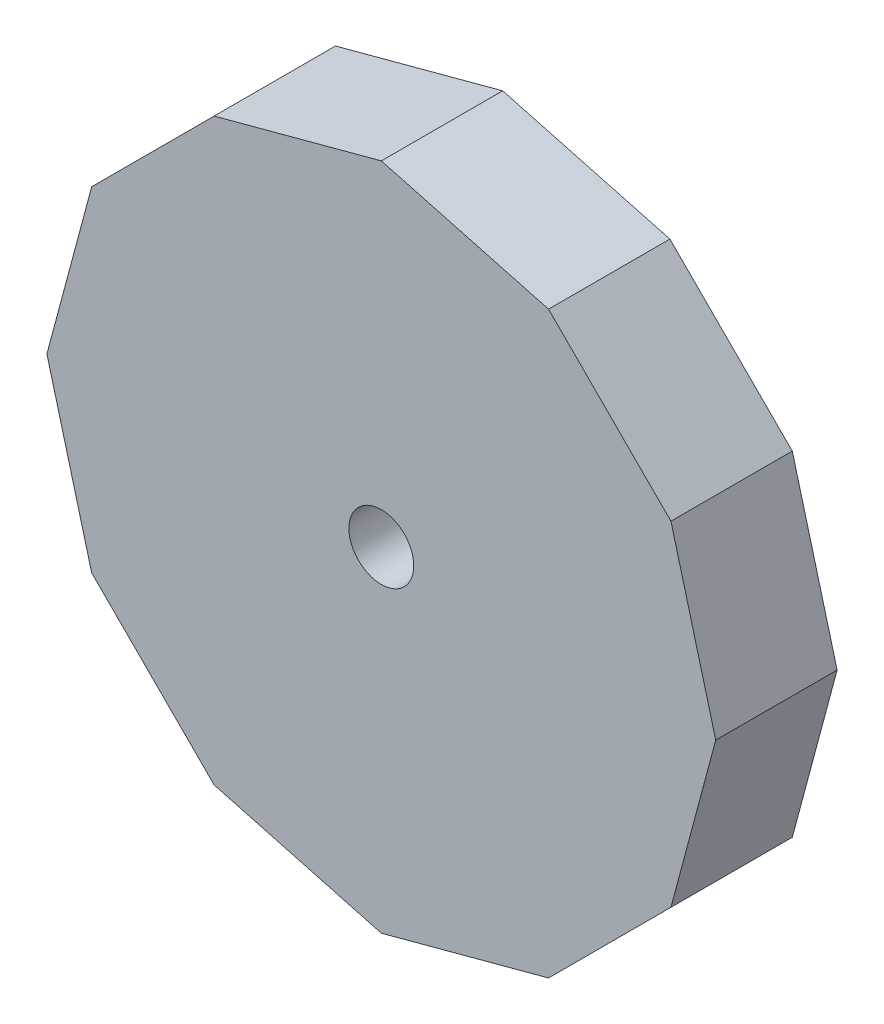
ISO-10303-21;
HEADER;
FILE_DESCRIPTION(('STEP AP214'),'2;1');
FILE_NAME('part.step','',(''),(''),'','','');
FILE_SCHEMA(('AUTOMOTIVE_DESIGN { 1 0 10303 214 1 1 1 1 }'));
ENDSEC;
DATA;
#1=APPLICATION_CONTEXT('core data for automotive mechanical design processes');
#2=APPLICATION_PROTOCOL_DEFINITION('international standard','automotive_design',2000,#1);
#3=PRODUCT_CONTEXT('',#1,'mechanical');
#4=PRODUCT('Part','Part','',(#3));
#5=PRODUCT_RELATED_PRODUCT_CATEGORY('part','',(#4));
#6=PRODUCT_DEFINITION_FORMATION('','',#4);
#7=PRODUCT_DEFINITION_CONTEXT('part definition',#1,'design');
#8=PRODUCT_DEFINITION('design','',#6,#7);
#9=PRODUCT_DEFINITION_SHAPE('','',#8);
#10=(LENGTH_UNIT() NAMED_UNIT(*) SI_UNIT(.MILLI.,.METRE.));
#11=(NAMED_UNIT(*) PLANE_ANGLE_UNIT() SI_UNIT($,.RADIAN.));
#12=(NAMED_UNIT(*) SI_UNIT($,.STERADIAN.) SOLID_ANGLE_UNIT());
#13=UNCERTAINTY_MEASURE_WITH_UNIT(LENGTH_MEASURE(1.E-05),#10,'distance_accuracy_value','');
#14=(GEOMETRIC_REPRESENTATION_CONTEXT(3) GLOBAL_UNCERTAINTY_ASSIGNED_CONTEXT((#13)) GLOBAL_UNIT_ASSIGNED_CONTEXT((#10,
#11,#12)) REPRESENTATION_CONTEXT('',''));
#15=CARTESIAN_POINT('',(0.,0.,0.));
#16=DIRECTION('',(0.,0.,1.));
#17=DIRECTION('',(1.,0.,0.));
#18=AXIS2_PLACEMENT_3D('',#15,#16,#17);
#19=CARTESIAN_POINT('',(-2750.81999999993,-4764.56000287049,1188.22000008192));
#20=DIRECTION('',(0.707106781186534,0.707106781186561,0.));
#21=DIRECTION('',(-0.707106781186561,0.707106781186534,0.));
#22=AXIS2_PLACEMENT_3D('',#19,#20,#21);
#23=PLANE('',#22);
#24=DIRECTION('',(0.,0.,-1.));
#25=VECTOR('',#24,1.);
#26=CARTESIAN_POINT('',(-4764.56000247659,-2750.8200003939,1188.22000008191));
#27=LINE('',#26,#25);
#28=CARTESIAN_POINT('',(-4764.56000247659,-2750.8200003939,1188.22000008191));
#29=VERTEX_POINT('',#28);
#30=CARTESIAN_POINT('',(-4764.56000247659,-2750.82000039391,-808.219999918092));
#31=VERTEX_POINT('',#30);
#32=EDGE_CURVE('E327',#29,#31,#27,.T.);
#33=ORIENTED_EDGE('',*,*,#32,.T.);
#34=DIRECTION('',(-0.707106781186561,0.707106781186534,0.));
#35=VECTOR('',#34,1.);
#36=CARTESIAN_POINT('',(-2750.81999999993,-4764.56000287049,-808.219999918085));
#37=LINE('',#36,#35);
#38=CARTESIAN_POINT('',(-2750.81999999993,-4764.56000287049,-808.219999918085));
#39=VERTEX_POINT('',#38);
#40=EDGE_CURVE('E63',#39,#31,#37,.T.);
#41=ORIENTED_EDGE('',*,*,#40,.F.);
#42=DIRECTION('',(0.,0.,-1.));
#43=VECTOR('',#42,1.);
#44=CARTESIAN_POINT('',(-2750.81999999999,-4764.56000287045,1188.22000008192));
#45=LINE('',#44,#43);
#46=CARTESIAN_POINT('',(-2750.81999999993,-4764.56000287049,1188.22000008192));
#47=VERTEX_POINT('',#46);
#48=EDGE_CURVE('E187',#47,#39,#45,.T.);
#49=ORIENTED_EDGE('',*,*,#48,.F.);
#50=DIRECTION('',(0.707106781186561,-0.707106781186534,0.));
#51=VECTOR('',#50,1.);
#52=CARTESIAN_POINT('',(-2750.81999999993,-4764.56000287049,1188.22000008192));
#53=LINE('',#52,#51);
#54=EDGE_CURVE('E336',#29,#47,#53,.T.);
#55=ORIENTED_EDGE('',*,*,#54,.F.);
#56=EDGE_LOOP('',(#33,#41,#49,#55));
#57=FACE_BOUND('',#56,.T.);
#58=ADVANCED_FACE('F46',(#57),#23,.F.);
#59=CARTESIAN_POINT('',(-2.06853544642894E-11,-3.93812871202215E-07,1188.2200000819));
#60=DIRECTION('',(0.,0.,-1.));
#61=DIRECTION('',(-0.499999999999983,-0.866025403784448,0.));
#62=AXIS2_PLACEMENT_3D('',#59,#60,#61);
#63=CYLINDRICAL_SURFACE('',#62,533.4);
#64=CARTESIAN_POINT('',(-2.06853544642893E-11,-3.93822974231739E-07,-1714.9999999181));
#65=DIRECTION('',(0.,0.,1.));
#66=DIRECTION('',(1.,0.,0.));
#67=AXIS2_PLACEMENT_3D('',#64,#65,#66);
#68=CIRCLE('',#67,533.4);
#69=CARTESIAN_POINT('',(533.399999999979,-3.93819249519447E-07,-1714.9999999181));
#70=VERTEX_POINT('',#69);
#71=EDGE_CURVE('E332',#70,#70,#68,.F.);
#72=ORIENTED_EDGE('',*,*,#71,.T.);
#73=EDGE_LOOP('',(#72));
#74=FACE_BOUND('',#73,.T.);
#75=CARTESIAN_POINT('',(-2.06853544642894E-11,-3.93812871202215E-07,1188.2200000819));
#76=DIRECTION('',(0.,0.,-1.));
#77=DIRECTION('',(0.499999999999983,0.866025403784448,0.));
#78=AXIS2_PLACEMENT_3D('',#75,#76,#77);
#79=CIRCLE('',#78,533.4);
#80=CARTESIAN_POINT('',(266.69999999997,461.937949984812,1188.2200000819));
#81=VERTEX_POINT('',#80);
#82=EDGE_CURVE('E53',#81,#81,#79,.T.);
#83=ORIENTED_EDGE('',*,*,#82,.F.);
#84=EDGE_LOOP('',(#83));
#85=FACE_BOUND('',#84,.T.);
#86=ADVANCED_FACE('F343',(#74,#85),#63,.F.);
#87=CARTESIAN_POINT('',(-2.06853544642894E-11,-3.93812871202215E-07,1188.2200000819));
#88=DIRECTION('',(0.,0.,1.));
#89=DIRECTION('',(0.499999999999983,0.866025403784448,0.));
#90=AXIS2_PLACEMENT_3D('',#87,#88,#89);
#91=PLANE('',#90);
#92=ORIENTED_EDGE('',*,*,#82,.T.);
#93=EDGE_LOOP('',(#92));
#94=FACE_BOUND('',#93,.T.);
#95=ORIENTED_EDGE('',*,*,#54,.T.);
#96=DIRECTION('',(0.96592582628907,-0.258819045102514,0.));
#97=VECTOR('',#96,1.);
#98=CARTESIAN_POINT('',(1.77323923217765E-11,-5501.64000039381,1188.22000008192));
#99=LINE('',#98,#97);
#100=CARTESIAN_POINT('',(1.99528383710268E-11,-5501.64000039381,1188.22000008192));
#101=VERTEX_POINT('',#100);
#102=EDGE_CURVE('E731',#47,#101,#99,.T.);
#103=ORIENTED_EDGE('',*,*,#102,.T.);
#104=DIRECTION('',(0.965925826289066,0.258819045102528,0.));
#105=VECTOR('',#104,1.);
#106=CARTESIAN_POINT('',(2750.82000000002,-4764.56000287041,1188.22000008192));
#107=LINE('',#106,#105);
#108=CARTESIAN_POINT('',(2750.82000000002,-4764.56000287041,1188.22000008192));
#109=VERTEX_POINT('',#108);
#110=EDGE_CURVE('E177',#101,#109,#107,.T.);
#111=ORIENTED_EDGE('',*,*,#110,.T.);
#112=DIRECTION('',(0.707106781186541,0.707106781186554,0.));
#113=VECTOR('',#112,1.);
#114=CARTESIAN_POINT('',(4764.56000247663,-2750.82000039377,1188.22000008191));
#115=LINE('',#114,#113);
#116=CARTESIAN_POINT('',(4764.56000247663,-2750.82000039377,1188.22000008191));
#117=VERTEX_POINT('',#116);
#118=EDGE_CURVE('E208',#109,#117,#115,.T.);
#119=ORIENTED_EDGE('',*,*,#118,.T.);
#120=DIRECTION('',(0.258819045102511,0.965925826289071,0.));
#121=VECTOR('',#120,1.);
#122=CARTESIAN_POINT('',(5501.63999999998,-3.93755139604934E-07,1188.2200000819));
#123=LINE('',#122,#121);
#124=CARTESIAN_POINT('',(5501.63999999998,-3.93753030181188E-07,1188.2200000819));
#125=VERTEX_POINT('',#124);
#126=EDGE_CURVE('E221',#117,#125,#123,.T.);
#127=ORIENTED_EDGE('',*,*,#126,.T.);
#128=DIRECTION('',(-0.258819045102532,0.965925826289066,0.));
#129=VECTOR('',#128,1.);
#130=CARTESIAN_POINT('',(4764.56000247657,2750.81999960624,1188.22000008189));
#131=LINE('',#130,#129);
#132=CARTESIAN_POINT('',(4764.56000247657,2750.81999960625,1188.22000008189));
#133=VERTEX_POINT('',#132);
#134=EDGE_CURVE('E235',#125,#133,#131,.T.);
#135=ORIENTED_EDGE('',*,*,#134,.T.);
#136=DIRECTION('',(-0.707106781186556,0.707106781186539,0.));
#137=VECTOR('',#136,1.);
#138=CARTESIAN_POINT('',(2750.81999999992,4764.56000208284,1188.22000008188));
#139=LINE('',#138,#137);
#140=CARTESIAN_POINT('',(2750.81999999992,4764.56000208284,1188.22000008188));
#141=VERTEX_POINT('',#140);
#142=EDGE_CURVE('E249',#133,#141,#139,.T.);
#143=ORIENTED_EDGE('',*,*,#142,.T.);
#144=DIRECTION('',(-0.965925826289072,0.258819045102508,0.));
#145=VECTOR('',#144,1.);
#146=CARTESIAN_POINT('',(-9.75208480364212E-11,5501.63999960619,1188.22000008188));
#147=LINE('',#146,#145);
#148=CARTESIAN_POINT('',(-9.9515219346711E-11,5501.63999960619,1188.22000008188));
#149=VERTEX_POINT('',#148);
#150=EDGE_CURVE('E263',#141,#149,#147,.T.);
#151=ORIENTED_EDGE('',*,*,#150,.T.);
#152=DIRECTION('',(-0.965925826289065,-0.258819045102535,0.));
#153=VECTOR('',#152,1.);
#154=CARTESIAN_POINT('',(-2750.82000000009,4764.56000208277,1188.22000008188));
#155=LINE('',#154,#153);
#156=CARTESIAN_POINT('',(-2750.8200000001,4764.56000208276,1188.22000008188));
#157=VERTEX_POINT('',#156);
#158=EDGE_CURVE('E277',#149,#157,#155,.T.);
#159=ORIENTED_EDGE('',*,*,#158,.T.);
#160=DIRECTION('',(-0.707106781186536,-0.707106781186559,0.));
#161=VECTOR('',#160,1.);
#162=CARTESIAN_POINT('',(-4764.56000247669,2750.81999960611,1188.22000008189));
#163=LINE('',#162,#161);
#164=CARTESIAN_POINT('',(-4764.56000247669,2750.81999960611,1188.22000008189));
#165=VERTEX_POINT('',#164);
#166=EDGE_CURVE('E291',#157,#165,#163,.T.);
#167=ORIENTED_EDGE('',*,*,#166,.T.);
#168=DIRECTION('',(-0.258819045102504,-0.965925826289073,0.));
#169=VECTOR('',#168,1.);
#170=CARTESIAN_POINT('',(-5501.64000000002,-3.93908905493845E-07,1188.2200000819));
#171=LINE('',#170,#169);
#172=CARTESIAN_POINT('',(-5501.64000000002,-3.93910792872987E-07,1188.2200000819));
#173=VERTEX_POINT('',#172);
#174=EDGE_CURVE('E305',#165,#173,#171,.T.);
#175=ORIENTED_EDGE('',*,*,#174,.T.);
#176=DIRECTION('',(0.258819045102538,-0.965925826289064,0.));
#177=VECTOR('',#176,1.);
#178=CARTESIAN_POINT('',(-4764.56000247659,-2750.8200003939,1188.22000008191));
#179=LINE('',#178,#177);
#180=EDGE_CURVE('E321',#173,#29,#179,.T.);
#181=ORIENTED_EDGE('',*,*,#180,.T.);
#182=EDGE_LOOP('',(#95,#103,#111,#119,#127,#135,#143,#151,#159,#167,#175,#181));
#183=FACE_BOUND('',#182,.T.);
#184=ADVANCED_FACE('F340',(#94,#183),#91,.T.);
#185=CARTESIAN_POINT('',(-2750.81999999993,-4764.56000287049,-808.219999918085));
#186=DIRECTION('',(0.142947377566867,0.142947377566876,0.979352895790638));
#187=DIRECTION('',(0.490348103876195,0.849307829308669,-0.195537587435302));
#188=AXIS2_PLACEMENT_3D('',#185,#186,#187);
#189=PLANE('',#188);
#190=DIRECTION('',(0.84930782930865,0.490348103876227,-0.195537587435301));
#191=VECTOR('',#190,1.);
#192=CARTESIAN_POINT('',(-958.000474190437,-553.101832051473,-1684.61068054542));
#193=LINE('',#192,#191);
#194=CARTESIAN_POINT('',(-826.00597017154,-476.894769624608,-1714.9999999181));
#195=VERTEX_POINT('',#194);
#196=EDGE_CURVE('E319',#31,#195,#193,.T.);
#197=ORIENTED_EDGE('',*,*,#196,.T.);
#198=DIRECTION('',(0.70710678118656,-0.707106781186535,0.));
#199=VECTOR('',#198,1.);
#200=CARTESIAN_POINT('',(355.419631537177,-1658.32037133328,-1714.99999991809));
#201=LINE('',#200,#199);
#202=CARTESIAN_POINT('',(-476.894769230774,-826.00597056536,-1714.9999999181));
#203=VERTEX_POINT('',#202);
#204=EDGE_CURVE('E12',#195,#203,#201,.T.);
#205=ORIENTED_EDGE('',*,*,#204,.T.);
#206=DIRECTION('',(-0.490348103876206,-0.849307829308662,0.195537587435302));
#207=VECTOR('',#206,1.);
#208=CARTESIAN_POINT('',(-553.101831657647,-958.000474584253,-1684.61068054542));
#209=LINE('',#208,#207);
#210=EDGE_CURVE('E188',#203,#39,#209,.T.);
#211=ORIENTED_EDGE('',*,*,#210,.T.);
#212=ORIENTED_EDGE('',*,*,#40,.T.);
#213=EDGE_LOOP('',(#197,#205,#211,#212));
#214=FACE_BOUND('',#213,.T.);
#215=ADVANCED_FACE('F350',(#214),#189,.F.);
#216=CARTESIAN_POINT('',(-2.06886671161642E-11,-3.93822974231739E-07,-1714.9999999181));
#217=DIRECTION('',(0.,0.,1.));
#218=DIRECTION('',(1.,0.,0.));
#219=AXIS2_PLACEMENT_3D('',#216,#217,#218);
#220=PLANE('',#219);
#221=ORIENTED_EDGE('',*,*,#71,.F.);
#222=EDGE_LOOP('',(#221));
#223=FACE_BOUND('',#222,.T.);
#224=ORIENTED_EDGE('',*,*,#204,.F.);
#225=DIRECTION('',(0.258819045102537,-0.965925826289064,0.));
#226=VECTOR('',#225,1.);
#227=CARTESIAN_POINT('',(-521.357755554834,-1613.85738500923,-1714.99999991809));
#228=LINE('',#227,#226);
#229=CARTESIAN_POINT('',(-953.78953846156,-3.93839738599411E-07,-1714.9999999181));
#230=VERTEX_POINT('',#229);
#231=EDGE_CURVE('E329',#230,#195,#228,.T.);
#232=ORIENTED_EDGE('',*,*,#231,.F.);
#233=DIRECTION('',(-0.258819045102505,-0.965925826289072,0.));
#234=VECTOR('',#233,1.);
#235=CARTESIAN_POINT('',(-1258.43775307823,-1136.96261577847,-1714.9999999181));
#236=LINE('',#235,#234);
#237=CARTESIAN_POINT('',(-826.005970171557,476.894768836933,-1714.9999999181));
#238=VERTEX_POINT('',#237);
#239=EDGE_CURVE('E311',#238,#230,#236,.T.);
#240=ORIENTED_EDGE('',*,*,#239,.F.);
#241=DIRECTION('',(-0.707106781186537,-0.707106781186558,0.));
#242=VECTOR('',#241,1.);
#243=CARTESIAN_POINT('',(-1658.32037093948,-355.419631931014,-1714.9999999181));
#244=LINE('',#243,#242);
#245=CARTESIAN_POINT('',(-476.894769230803,826.005969777698,-1714.9999999181));
#246=VERTEX_POINT('',#245);
#247=EDGE_CURVE('E297',#246,#238,#244,.T.);
#248=ORIENTED_EDGE('',*,*,#247,.F.);
#249=DIRECTION('',(-0.965925826289065,-0.258819045102534,0.));
#250=VECTOR('',#249,1.);
#251=CARTESIAN_POINT('',(-1613.85738461542,521.357755160996,-1714.9999999181));
#252=LINE('',#251,#250);
#253=CARTESIAN_POINT('',(-3.39960303214757E-11,953.789538067717,-1714.9999999181));
#254=VERTEX_POINT('',#253);
#255=EDGE_CURVE('E283',#254,#246,#252,.T.);
#256=ORIENTED_EDGE('',*,*,#255,.F.);
#257=DIRECTION('',(-0.965925826289072,0.258819045102508,0.));
#258=VECTOR('',#257,1.);
#259=CARTESIAN_POINT('',(-1136.96261538466,1258.43775268439,-1714.9999999181));
#260=LINE('',#259,#258);
#261=CARTESIAN_POINT('',(476.894769230738,826.005969777712,-1714.9999999181));
#262=VERTEX_POINT('',#261);
#263=EDGE_CURVE('E269',#262,#254,#260,.T.);
#264=ORIENTED_EDGE('',*,*,#263,.F.);
#265=DIRECTION('',(-0.707106781186556,0.707106781186539,0.));
#266=VECTOR('',#265,1.);
#267=CARTESIAN_POINT('',(-355.419631537206,1658.32037054564,-1714.9999999181));
#268=LINE('',#267,#266);
#269=CARTESIAN_POINT('',(826.005970171503,476.894768836957,-1714.9999999181));
#270=VERTEX_POINT('',#269);
#271=EDGE_CURVE('E255',#270,#262,#268,.T.);
#272=ORIENTED_EDGE('',*,*,#271,.F.);
#273=DIRECTION('',(-0.258819045102531,0.965925826289066,0.));
#274=VECTOR('',#273,1.);
#275=CARTESIAN_POINT('',(521.357755554805,1613.85738422157,-1714.9999999181));
#276=LINE('',#275,#274);
#277=CARTESIAN_POINT('',(953.789538461519,-3.93812760179912E-07,-1714.9999999181));
#278=VERTEX_POINT('',#277);
#279=EDGE_CURVE('E241',#278,#270,#276,.T.);
#280=ORIENTED_EDGE('',*,*,#279,.F.);
#281=DIRECTION('',(0.258819045102512,0.965925826289071,0.));
#282=VECTOR('',#281,1.);
#283=CARTESIAN_POINT('',(1258.4377530782,1136.96261499081,-1714.9999999181));
#284=LINE('',#283,#282);
#285=CARTESIAN_POINT('',(826.005970171512,-476.894769624585,-1714.9999999181));
#286=VERTEX_POINT('',#285);
#287=EDGE_CURVE('E227',#286,#278,#284,.T.);
#288=ORIENTED_EDGE('',*,*,#287,.F.);
#289=DIRECTION('',(0.707106781186542,0.707106781186553,0.));
#290=VECTOR('',#289,1.);
#291=CARTESIAN_POINT('',(1658.32037093944,355.419631143356,-1714.9999999181));
#292=LINE('',#291,#290);
#293=CARTESIAN_POINT('',(476.894769230756,-826.005970565348,-1714.9999999181));
#294=VERTEX_POINT('',#293);
#295=EDGE_CURVE('E214',#294,#286,#292,.T.);
#296=ORIENTED_EDGE('',*,*,#295,.F.);
#297=DIRECTION('',(0.965925826289067,0.258819045102527,0.));
#298=VECTOR('',#297,1.);
#299=CARTESIAN_POINT('',(1613.85738461538,-521.357755948654,-1714.9999999181));
#300=LINE('',#299,#298);
#301=CARTESIAN_POINT('',(-1.40250777148448E-11,-953.789538855363,-1714.9999999181));
#302=VERTEX_POINT('',#301);
#303=EDGE_CURVE('E200',#302,#294,#300,.T.);
#304=ORIENTED_EDGE('',*,*,#303,.F.);
#305=DIRECTION('',(0.96592582628907,-0.258819045102516,0.));
#306=VECTOR('',#305,1.);
#307=CARTESIAN_POINT('',(1136.96261538461,-1258.43775347204,-1714.9999999181));
#308=LINE('',#307,#306);
#309=EDGE_CURVE('E173',#203,#302,#308,.T.);
#310=ORIENTED_EDGE('',*,*,#309,.F.);
#311=EDGE_LOOP('',(#224,#232,#240,#248,#256,#264,#272,#280,#288,#296,#304,#310));
#312=FACE_BOUND('',#311,.T.);
#313=ADVANCED_FACE('F356',(#223,#312),#220,.F.);
#314=CARTESIAN_POINT('',(-4764.56000247659,-2750.8200003939,1188.22000008191));
#315=DIRECTION('',(0.965925826289064,0.258819045102538,0.));
#316=DIRECTION('',(-0.258819045102538,0.965925826289064,0.));
#317=AXIS2_PLACEMENT_3D('',#314,#315,#316);
#318=PLANE('',#317);
#319=DIRECTION('',(0.,0.,-1.));
#320=VECTOR('',#319,1.);
#321=CARTESIAN_POINT('',(-5501.64000000002,-3.93910792872987E-07,1188.2200000819));
#322=LINE('',#321,#320);
#323=CARTESIAN_POINT('',(-5501.64000000002,-3.93917676255739E-07,-808.219999918099));
#324=VERTEX_POINT('',#323);
#325=EDGE_CURVE('E324',#173,#324,#322,.T.);
#326=ORIENTED_EDGE('',*,*,#325,.T.);
#327=DIRECTION('',(-0.258819045102538,0.965925826289064,0.));
#328=VECTOR('',#327,1.);
#329=CARTESIAN_POINT('',(-4764.56000247659,-2750.82000039391,-808.219999918092));
#330=LINE('',#329,#328);
#331=EDGE_CURVE('E314',#31,#324,#330,.T.);
#332=ORIENTED_EDGE('',*,*,#331,.F.);
#333=ORIENTED_EDGE('',*,*,#32,.F.);
#334=ORIENTED_EDGE('',*,*,#180,.F.);
#335=EDGE_LOOP('',(#326,#332,#333,#334));
#336=FACE_BOUND('',#335,.T.);
#337=ADVANCED_FACE('F359',(#336),#318,.F.);
#338=CARTESIAN_POINT('',(-4764.56000247659,-2750.82000039391,-808.219999918092));
#339=DIRECTION('',(0.195269749160709,0.052322371593847,0.979352895790638));
#340=DIRECTION('',(0.84930782930865,0.490348103876227,-0.195537587435301));
#341=AXIS2_PLACEMENT_3D('',#338,#339,#340);
#342=PLANE('',#341);
#343=DIRECTION('',(-0.980696207752423,0.,0.195537587435299));
#344=VECTOR('',#343,1.);
#345=CARTESIAN_POINT('',(-1106.20366331528,-3.93842625179275E-07,-1684.61068054542));
#346=LINE('',#345,#344);
#347=EDGE_CURVE('E316',#230,#324,#346,.T.);
#348=ORIENTED_EDGE('',*,*,#347,.F.);
#349=ORIENTED_EDGE('',*,*,#231,.T.);
#350=ORIENTED_EDGE('',*,*,#196,.F.);
#351=ORIENTED_EDGE('',*,*,#331,.T.);
#352=EDGE_LOOP('',(#348,#349,#350,#351));
#353=FACE_BOUND('',#352,.T.);
#354=ADVANCED_FACE('F363',(#353),#342,.F.);
#355=CARTESIAN_POINT('',(-5501.64000000002,-3.93908905493845E-07,1188.2200000819));
#356=DIRECTION('',(0.965925826289073,-0.258819045102504,0.));
#357=DIRECTION('',(0.258819045102504,0.965925826289073,0.));
#358=AXIS2_PLACEMENT_3D('',#355,#356,#357);
#359=PLANE('',#358);
#360=DIRECTION('',(0.,0.,-1.));
#361=VECTOR('',#360,1.);
#362=CARTESIAN_POINT('',(-4764.56000247669,2750.81999960611,1188.22000008189));
#363=LINE('',#362,#361);
#364=CARTESIAN_POINT('',(-4764.56000247669,2750.8199996061,-808.21999991811));
#365=VERTEX_POINT('',#364);
#366=EDGE_CURVE('E308',#165,#365,#363,.T.);
#367=ORIENTED_EDGE('',*,*,#366,.T.);
#368=DIRECTION('',(0.258819045102504,0.965925826289073,0.));
#369=VECTOR('',#368,1.);
#370=CARTESIAN_POINT('',(-5501.64000000002,-3.93916010921203E-07,-808.219999918099));
#371=LINE('',#370,#369);
#372=EDGE_CURVE('E300',#324,#365,#371,.T.);
#373=ORIENTED_EDGE('',*,*,#372,.F.);
#374=ORIENTED_EDGE('',*,*,#325,.F.);
#375=ORIENTED_EDGE('',*,*,#174,.F.);
#376=EDGE_LOOP('',(#367,#373,#374,#375));
#377=FACE_BOUND('',#376,.T.);
#378=ADVANCED_FACE('F367',(#377),#359,.F.);
#379=CARTESIAN_POINT('',(-5501.64000000002,-3.93916010921203E-07,-808.219999918099));
#380=DIRECTION('',(0.195269749160711,-0.0523223715938336,0.979352895790639));
#381=DIRECTION('',(0.980696207752423,0.,-0.195537587435299));
#382=AXIS2_PLACEMENT_3D('',#379,#380,#381);
#383=PLANE('',#382);
#384=DIRECTION('',(-0.849307829308668,0.490348103876198,0.195537587435297));
#385=VECTOR('',#384,1.);
#386=CARTESIAN_POINT('',(-958.000474190457,553.101831263793,-1684.61068054543));
#387=LINE('',#386,#385);
#388=EDGE_CURVE('E302',#238,#365,#387,.T.);
#389=ORIENTED_EDGE('',*,*,#388,.F.);
#390=ORIENTED_EDGE('',*,*,#239,.T.);
#391=ORIENTED_EDGE('',*,*,#347,.T.);
#392=ORIENTED_EDGE('',*,*,#372,.T.);
#393=EDGE_LOOP('',(#389,#390,#391,#392));
#394=FACE_BOUND('',#393,.T.);
#395=ADVANCED_FACE('F371',(#394),#383,.F.);
#396=CARTESIAN_POINT('',(-4764.56000247669,2750.81999960611,1188.22000008189));
#397=DIRECTION('',(0.707106781186559,-0.707106781186536,0.));
#398=DIRECTION('',(0.707106781186537,0.707106781186559,0.));
#399=AXIS2_PLACEMENT_3D('',#396,#397,#398);
#400=PLANE('',#399);
#401=DIRECTION('',(0.,0.,-1.));
#402=VECTOR('',#401,1.);
#403=CARTESIAN_POINT('',(-2750.8200000001,4764.56000208276,1188.22000008188));
#404=LINE('',#403,#402);
#405=CARTESIAN_POINT('',(-2750.8200000001,4764.56000208276,-808.219999918117));
#406=VERTEX_POINT('',#405);
#407=EDGE_CURVE('E294',#157,#406,#404,.T.);
#408=ORIENTED_EDGE('',*,*,#407,.T.);
#409=DIRECTION('',(0.707106781186536,0.707106781186559,0.));
#410=VECTOR('',#409,1.);
#411=CARTESIAN_POINT('',(-4764.56000247669,2750.8199996061,-808.21999991811));
#412=LINE('',#411,#410);
#413=EDGE_CURVE('E286',#365,#406,#412,.T.);
#414=ORIENTED_EDGE('',*,*,#413,.F.);
#415=ORIENTED_EDGE('',*,*,#366,.F.);
#416=ORIENTED_EDGE('',*,*,#166,.F.);
#417=EDGE_LOOP('',(#408,#414,#415,#416));
#418=FACE_BOUND('',#417,.T.);
#419=ADVANCED_FACE('F375',(#418),#400,.F.);
#420=CARTESIAN_POINT('',(-4764.56000247669,2750.8199996061,-808.21999991811));
#421=DIRECTION('',(0.142947377566872,-0.142947377566864,0.979352895790639));
#422=DIRECTION('',(0.849307829308668,-0.490348103876198,-0.195537587435297));
#423=AXIS2_PLACEMENT_3D('',#420,#421,#422);
#424=PLANE('',#423);
#425=DIRECTION('',(-0.490348103876224,0.849307829308653,0.195537587435296));
#426=VECTOR('',#425,1.);
#427=CARTESIAN_POINT('',(-553.101831657668,958.000473796595,-1684.61068054543));
#428=LINE('',#427,#426);
#429=EDGE_CURVE('E288',#246,#406,#428,.T.);
#430=ORIENTED_EDGE('',*,*,#429,.F.);
#431=ORIENTED_EDGE('',*,*,#247,.T.);
#432=ORIENTED_EDGE('',*,*,#388,.T.);
#433=ORIENTED_EDGE('',*,*,#413,.T.);
#434=EDGE_LOOP('',(#430,#431,#432,#433));
#435=FACE_BOUND('',#434,.T.);
#436=ADVANCED_FACE('F379',(#435),#424,.F.);
#437=CARTESIAN_POINT('',(-2750.82000000009,4764.56000208277,1188.22000008188));
#438=DIRECTION('',(0.258819045102535,-0.965925826289065,0.));
#439=DIRECTION('',(0.965925826289065,0.258819045102535,0.));
#440=AXIS2_PLACEMENT_3D('',#437,#438,#439);
#441=PLANE('',#440);
#442=DIRECTION('',(0.,0.,-1.));
#443=VECTOR('',#442,1.);
#444=CARTESIAN_POINT('',(-9.9515219346711E-11,5501.63999960619,1188.22000008188));
#445=LINE('',#444,#443);
#446=CARTESIAN_POINT('',(-9.95152193467109E-11,5501.63999960618,-808.21999991812));
#447=VERTEX_POINT('',#446);
#448=EDGE_CURVE('E280',#149,#447,#445,.T.);
#449=ORIENTED_EDGE('',*,*,#448,.T.);
#450=DIRECTION('',(0.965925826289065,0.258819045102535,0.));
#451=VECTOR('',#450,1.);
#452=CARTESIAN_POINT('',(-2750.82000000009,4764.56000208276,-808.219999918117));
#453=LINE('',#452,#451);
#454=EDGE_CURVE('E272',#406,#447,#453,.T.);
#455=ORIENTED_EDGE('',*,*,#454,.F.);
#456=ORIENTED_EDGE('',*,*,#407,.F.);
#457=ORIENTED_EDGE('',*,*,#158,.F.);
#458=EDGE_LOOP('',(#449,#455,#456,#457));
#459=FACE_BOUND('',#458,.T.);
#460=ADVANCED_FACE('F383',(#459),#441,.F.);
#461=CARTESIAN_POINT('',(-2750.82000000009,4764.56000208276,-808.219999918117));
#462=DIRECTION('',(0.0523223715938429,-0.195269749160706,0.979352895790639));
#463=DIRECTION('',(0.490348103876224,-0.849307829308653,-0.195537587435296));
#464=AXIS2_PLACEMENT_3D('',#461,#462,#463);
#465=PLANE('',#464);
#466=DIRECTION('',(0.,0.980696207752423,0.195537587435296));
#467=VECTOR('',#466,1.);
#468=CARTESIAN_POINT('',(-3.66810948925971E-11,1106.20366292144,-1684.61068054543));
#469=LINE('',#468,#467);
#470=EDGE_CURVE('E274',#254,#447,#469,.T.);
#471=ORIENTED_EDGE('',*,*,#470,.F.);
#472=ORIENTED_EDGE('',*,*,#255,.T.);
#473=ORIENTED_EDGE('',*,*,#429,.T.);
#474=ORIENTED_EDGE('',*,*,#454,.T.);
#475=EDGE_LOOP('',(#471,#472,#473,#474));
#476=FACE_BOUND('',#475,.T.);
#477=ADVANCED_FACE('F387',(#476),#465,.F.);
#478=CARTESIAN_POINT('',(-9.75208480364212E-11,5501.63999960619,1188.22000008188));
#479=DIRECTION('',(-0.258819045102508,-0.965925826289072,0.));
#480=DIRECTION('',(0.965925826289072,-0.258819045102508,0.));
#481=AXIS2_PLACEMENT_3D('',#478,#479,#480);
#482=PLANE('',#481);
#483=DIRECTION('',(0.,0.,-1.));
#484=VECTOR('',#483,1.);
#485=CARTESIAN_POINT('',(2750.81999999992,4764.56000208284,1188.22000008188));
#486=LINE('',#485,#484);
#487=CARTESIAN_POINT('',(2750.81999999992,4764.56000208284,-808.219999918117));
#488=VERTEX_POINT('',#487);
#489=EDGE_CURVE('E266',#141,#488,#486,.T.);
#490=ORIENTED_EDGE('',*,*,#489,.T.);
#491=DIRECTION('',(0.965925826289072,-0.258819045102508,0.));
#492=VECTOR('',#491,1.);
#493=CARTESIAN_POINT('',(-9.77428926413461E-11,5501.63999960618,-808.21999991812));
#494=LINE('',#493,#492);
#495=EDGE_CURVE('E258',#447,#488,#494,.T.);
#496=ORIENTED_EDGE('',*,*,#495,.F.);
#497=ORIENTED_EDGE('',*,*,#448,.F.);
#498=ORIENTED_EDGE('',*,*,#150,.F.);
#499=EDGE_LOOP('',(#490,#496,#497,#498));
#500=FACE_BOUND('',#499,.T.);
#501=ADVANCED_FACE('F391',(#500),#482,.F.);
#502=CARTESIAN_POINT('',(-9.77428926413461E-11,5501.63999960618,-808.21999991812));
#503=DIRECTION('',(-0.0523223715938377,-0.195269749160707,0.979352895790639));
#504=DIRECTION('',(0.,-0.980696207752423,-0.195537587435296));
#505=AXIS2_PLACEMENT_3D('',#502,#503,#504);
#506=PLANE('',#505);
#507=DIRECTION('',(0.4903481038762,0.849307829308667,0.195537587435296));
#508=VECTOR('',#507,1.);
#509=CARTESIAN_POINT('',(553.101831657599,958.000473796612,-1684.61068054543));
#510=LINE('',#509,#508);
#511=EDGE_CURVE('E260',#262,#488,#510,.T.);
#512=ORIENTED_EDGE('',*,*,#511,.F.);
#513=ORIENTED_EDGE('',*,*,#263,.T.);
#514=ORIENTED_EDGE('',*,*,#470,.T.);
#515=ORIENTED_EDGE('',*,*,#495,.T.);
#516=EDGE_LOOP('',(#512,#513,#514,#515));
#517=FACE_BOUND('',#516,.T.);
#518=ADVANCED_FACE('F395',(#517),#506,.F.);
#519=CARTESIAN_POINT('',(2750.81999999992,4764.56000208284,1188.22000008188));
#520=DIRECTION('',(-0.707106781186539,-0.707106781186556,0.));
#521=DIRECTION('',(0.707106781186556,-0.707106781186539,0.));
#522=AXIS2_PLACEMENT_3D('',#519,#520,#521);
#523=PLANE('',#522);
#524=DIRECTION('',(0.,0.,-1.));
#525=VECTOR('',#524,1.);
#526=CARTESIAN_POINT('',(4764.56000247657,2750.81999960625,1188.22000008189));
#527=LINE('',#526,#525);
#528=CARTESIAN_POINT('',(4764.56000247657,2750.81999960624,-808.21999991811));
#529=VERTEX_POINT('',#528);
#530=EDGE_CURVE('E252',#133,#529,#527,.T.);
#531=ORIENTED_EDGE('',*,*,#530,.T.);
#532=DIRECTION('',(0.707106781186556,-0.707106781186539,0.));
#533=VECTOR('',#532,1.);
#534=CARTESIAN_POINT('',(2750.81999999992,4764.56000208284,-808.219999918117));
#535=LINE('',#534,#533);
#536=EDGE_CURVE('E244',#488,#529,#535,.T.);
#537=ORIENTED_EDGE('',*,*,#536,.F.);
#538=ORIENTED_EDGE('',*,*,#489,.F.);
#539=ORIENTED_EDGE('',*,*,#142,.F.);
#540=EDGE_LOOP('',(#531,#537,#538,#539));
#541=FACE_BOUND('',#540,.T.);
#542=ADVANCED_FACE('F399',(#541),#523,.F.);
#543=CARTESIAN_POINT('',(2750.81999999992,4764.56000208284,-808.219999918117));
#544=DIRECTION('',(-0.142947377566868,-0.142947377566868,0.979352895790639));
#545=DIRECTION('',(-0.4903481038762,-0.849307829308667,-0.195537587435296));
#546=AXIS2_PLACEMENT_3D('',#543,#544,#545);
#547=PLANE('',#546);
#548=DIRECTION('',(0.849307829308654,0.490348103876222,0.195537587435297));
#549=VECTOR('',#548,1.);
#550=CARTESIAN_POINT('',(958.0004741904,553.101831263821,-1684.61068054543));
#551=LINE('',#550,#549);
#552=EDGE_CURVE('E246',#270,#529,#551,.T.);
#553=ORIENTED_EDGE('',*,*,#552,.F.);
#554=ORIENTED_EDGE('',*,*,#271,.T.);
#555=ORIENTED_EDGE('',*,*,#511,.T.);
#556=ORIENTED_EDGE('',*,*,#536,.T.);
#557=EDGE_LOOP('',(#553,#554,#555,#556));
#558=FACE_BOUND('',#557,.T.);
#559=ADVANCED_FACE('F403',(#558),#547,.F.);
#560=CARTESIAN_POINT('',(4764.56000247657,2750.81999960624,1188.22000008189));
#561=DIRECTION('',(-0.965925826289066,-0.258819045102532,0.));
#562=DIRECTION('',(0.258819045102532,-0.965925826289066,0.));
#563=AXIS2_PLACEMENT_3D('',#560,#561,#562);
#564=PLANE('',#563);
#565=DIRECTION('',(0.,0.,-1.));
#566=VECTOR('',#565,1.);
#567=CARTESIAN_POINT('',(5501.63999999998,-3.93753030181188E-07,1188.2200000819));
#568=LINE('',#567,#566);
#569=CARTESIAN_POINT('',(5501.63999999998,-3.93760024586243E-07,-808.219999918099));
#570=VERTEX_POINT('',#569);
#571=EDGE_CURVE('E238',#125,#570,#568,.T.);
#572=ORIENTED_EDGE('',*,*,#571,.T.);
#573=DIRECTION('',(0.258819045102532,-0.965925826289066,0.));
#574=VECTOR('',#573,1.);
#575=CARTESIAN_POINT('',(4764.56000247657,2750.81999960624,-808.21999991811));
#576=LINE('',#575,#574);
#577=EDGE_CURVE('E230',#529,#570,#576,.T.);
#578=ORIENTED_EDGE('',*,*,#577,.F.);
#579=ORIENTED_EDGE('',*,*,#530,.F.);
#580=ORIENTED_EDGE('',*,*,#134,.F.);
#581=EDGE_LOOP('',(#572,#578,#579,#580));
#582=FACE_BOUND('',#581,.T.);
#583=ADVANCED_FACE('F407',(#582),#564,.F.);
#584=CARTESIAN_POINT('',(4764.56000247657,2750.81999960624,-808.21999991811));
#585=DIRECTION('',(-0.19526974916071,-0.0523223715938388,0.979352895790639));
#586=DIRECTION('',(-0.849307829308654,-0.490348103876222,-0.195537587435297));
#587=AXIS2_PLACEMENT_3D('',#584,#585,#586);
#588=PLANE('',#587);
#589=DIRECTION('',(0.980696207752423,0.,0.195537587435299));
#590=VECTOR('',#589,1.);
#591=CARTESIAN_POINT('',(1106.20366331524,-3.93810761778468E-07,-1684.61068054542));
#592=LINE('',#591,#590);
#593=EDGE_CURVE('E232',#278,#570,#592,.T.);
#594=ORIENTED_EDGE('',*,*,#593,.F.);
#595=ORIENTED_EDGE('',*,*,#279,.T.);
#596=ORIENTED_EDGE('',*,*,#552,.T.);
#597=ORIENTED_EDGE('',*,*,#577,.T.);
#598=EDGE_LOOP('',(#594,#595,#596,#597));
#599=FACE_BOUND('',#598,.T.);
#600=ADVANCED_FACE('F411',(#599),#588,.F.);
#601=CARTESIAN_POINT('',(5501.63999999998,-3.93755139604934E-07,1188.2200000819));
#602=DIRECTION('',(-0.965925826289071,0.258819045102511,0.));
#603=DIRECTION('',(-0.258819045102511,-0.965925826289071,0.));
#604=AXIS2_PLACEMENT_3D('',#601,#602,#603);
#605=PLANE('',#604);
#606=DIRECTION('',(0.,0.,-1.));
#607=VECTOR('',#606,1.);
#608=CARTESIAN_POINT('',(4764.56000247663,-2750.82000039377,1188.22000008191));
#609=LINE('',#608,#607);
#610=CARTESIAN_POINT('',(4764.56000247663,-2750.82000039378,-808.219999918092));
#611=VERTEX_POINT('',#610);
#612=EDGE_CURVE('E224',#117,#611,#609,.T.);
#613=ORIENTED_EDGE('',*,*,#612,.T.);
#614=DIRECTION('',(-0.258819045102511,-0.965925826289071,0.));
#615=VECTOR('',#614,1.);
#616=CARTESIAN_POINT('',(5501.63999999998,-3.93761911965385E-07,-808.219999918099));
#617=LINE('',#616,#615);
#618=EDGE_CURVE('E216',#570,#611,#617,.T.);
#619=ORIENTED_EDGE('',*,*,#618,.F.);
#620=ORIENTED_EDGE('',*,*,#571,.F.);
#621=ORIENTED_EDGE('',*,*,#126,.F.);
#622=EDGE_LOOP('',(#613,#619,#620,#621));
#623=FACE_BOUND('',#622,.T.);
#624=ADVANCED_FACE('F415',(#623),#605,.F.);
#625=CARTESIAN_POINT('',(5501.63999999998,-3.93761911965385E-07,-808.219999918099));
#626=DIRECTION('',(-0.195269749160711,0.0523223715938418,0.979352895790638));
#627=DIRECTION('',(-0.980696207752423,0.,-0.195537587435299));
#628=AXIS2_PLACEMENT_3D('',#625,#626,#627);
#629=PLANE('',#628);
#630=DIRECTION('',(0.849307829308664,-0.490348103876202,0.195537587435301));
#631=VECTOR('',#630,1.);
#632=CARTESIAN_POINT('',(958.000474190412,-553.101832051446,-1684.61068054542));
#633=LINE('',#632,#631);
#634=EDGE_CURVE('E219',#286,#611,#633,.T.);
#635=ORIENTED_EDGE('',*,*,#634,.F.);
#636=ORIENTED_EDGE('',*,*,#287,.T.);
#637=ORIENTED_EDGE('',*,*,#593,.T.);
#638=ORIENTED_EDGE('',*,*,#618,.T.);
#639=EDGE_LOOP('',(#635,#636,#637,#638));
#640=FACE_BOUND('',#639,.T.);
#641=ADVANCED_FACE('F419',(#640),#629,.F.);
#642=CARTESIAN_POINT('',(4764.56000247663,-2750.82000039377,1188.22000008191));
#643=DIRECTION('',(-0.707106781186554,0.707106781186541,0.));
#644=DIRECTION('',(-0.707106781186541,-0.707106781186554,0.));
#645=AXIS2_PLACEMENT_3D('',#642,#643,#644);
#646=PLANE('',#645);
#647=DIRECTION('',(0.,0.,-1.));
#648=VECTOR('',#647,1.);
#649=CARTESIAN_POINT('',(2750.82000000002,-4764.56000287041,1188.22000008192));
#650=LINE('',#649,#648);
#651=CARTESIAN_POINT('',(2750.82000000002,-4764.56000287042,-808.219999918085));
#652=VERTEX_POINT('',#651);
#653=EDGE_CURVE('E211',#109,#652,#650,.T.);
#654=ORIENTED_EDGE('',*,*,#653,.T.);
#655=DIRECTION('',(-0.707106781186541,-0.707106781186554,0.));
#656=VECTOR('',#655,1.);
#657=CARTESIAN_POINT('',(4764.56000247663,-2750.82000039378,-808.219999918092));
#658=LINE('',#657,#656);
#659=EDGE_CURVE('E202',#611,#652,#658,.T.);
#660=ORIENTED_EDGE('',*,*,#659,.F.);
#661=ORIENTED_EDGE('',*,*,#612,.F.);
#662=ORIENTED_EDGE('',*,*,#118,.F.);
#663=EDGE_LOOP('',(#654,#660,#661,#662));
#664=FACE_BOUND('',#663,.T.);
#665=ADVANCED_FACE('F423',(#664),#646,.F.);
#666=CARTESIAN_POINT('',(4764.56000247663,-2750.82000039378,-808.219999918092));
#667=DIRECTION('',(-0.142947377566871,0.142947377566872,0.979352895790638));
#668=DIRECTION('',(-0.849307829308664,0.490348103876203,-0.195537587435301));
#669=AXIS2_PLACEMENT_3D('',#666,#667,#668);
#670=PLANE('',#669);
#671=DIRECTION('',(0.490348103876219,-0.849307829308655,0.195537587435302));
#672=VECTOR('',#671,1.);
#673=CARTESIAN_POINT('',(553.10183165762,-958.000474584245,-1684.61068054542));
#674=LINE('',#673,#672);
#675=EDGE_CURVE('E193',#294,#652,#674,.T.);
#676=ORIENTED_EDGE('',*,*,#675,.F.);
#677=ORIENTED_EDGE('',*,*,#295,.T.);
#678=ORIENTED_EDGE('',*,*,#634,.T.);
#679=ORIENTED_EDGE('',*,*,#659,.T.);
#680=EDGE_LOOP('',(#676,#677,#678,#679));
#681=FACE_BOUND('',#680,.T.);
#682=ADVANCED_FACE('F427',(#681),#670,.F.);
#683=CARTESIAN_POINT('',(2750.82000000002,-4764.56000287041,1188.22000008192));
#684=DIRECTION('',(-0.258819045102528,0.965925826289066,0.));
#685=DIRECTION('',(-0.965925826289067,-0.258819045102528,0.));
#686=AXIS2_PLACEMENT_3D('',#683,#684,#685);
#687=PLANE('',#686);
#688=DIRECTION('',(0.,0.,-1.));
#689=VECTOR('',#688,1.);
#690=CARTESIAN_POINT('',(1.99528383710268E-11,-5501.64000039381,1188.22000008192));
#691=LINE('',#690,#689);
#692=CARTESIAN_POINT('',(1.79544369267016E-11,-5501.64000039382,-808.219999918081));
#693=VERTEX_POINT('',#692);
#694=EDGE_CURVE('E184',#101,#693,#691,.T.);
#695=ORIENTED_EDGE('',*,*,#694,.T.);
#696=DIRECTION('',(-0.965925826289066,-0.258819045102528,0.));
#697=VECTOR('',#696,1.);
#698=CARTESIAN_POINT('',(2750.82000000002,-4764.56000287042,-808.219999918085));
#699=LINE('',#698,#697);
#700=EDGE_CURVE('E178',#652,#693,#699,.T.);
#701=ORIENTED_EDGE('',*,*,#700,.F.);
#702=ORIENTED_EDGE('',*,*,#653,.F.);
#703=ORIENTED_EDGE('',*,*,#110,.F.);
#704=EDGE_LOOP('',(#695,#701,#702,#703));
#705=FACE_BOUND('',#704,.T.);
#706=ADVANCED_FACE('F198',(#705),#687,.F.);
#707=CARTESIAN_POINT('',(2750.82000000002,-4764.56000287042,-808.219999918085));
#708=DIRECTION('',(-0.0523223715938415,0.195269749160713,0.979352895790638));
#709=DIRECTION('',(-0.490348103876218,0.849307829308655,-0.195537587435302));
#710=AXIS2_PLACEMENT_3D('',#707,#708,#709);
#711=PLANE('',#710);
#712=DIRECTION('',(0.,-0.980696207752422,0.195537587435302));
#713=VECTOR('',#712,1.);
#714=CARTESIAN_POINT('',(-1.24611752083577E-11,-1106.20366370909,-1684.61068054542));
#715=LINE('',#714,#713);
#716=EDGE_CURVE('E167',#302,#693,#715,.T.);
#717=ORIENTED_EDGE('',*,*,#716,.F.);
#718=ORIENTED_EDGE('',*,*,#303,.T.);
#719=ORIENTED_EDGE('',*,*,#675,.T.);
#720=ORIENTED_EDGE('',*,*,#700,.T.);
#721=EDGE_LOOP('',(#717,#718,#719,#720));
#722=FACE_BOUND('',#721,.T.);
#723=ADVANCED_FACE('F191',(#722),#711,.F.);
#724=CARTESIAN_POINT('',(1.77323923217765E-11,-5501.64000039381,1188.22000008192));
#725=DIRECTION('',(0.258819045102514,0.96592582628907,0.));
#726=DIRECTION('',(-0.96592582628907,0.258819045102515,0.));
#727=AXIS2_PLACEMENT_3D('',#724,#725,#726);
#728=PLANE('',#727);
#729=ORIENTED_EDGE('',*,*,#48,.T.);
#730=DIRECTION('',(-0.96592582628907,0.258819045102514,0.));
#731=VECTOR('',#730,1.);
#732=CARTESIAN_POINT('',(1.79544369267016E-11,-5501.64000039382,-808.219999918081));
#733=LINE('',#732,#731);
#734=EDGE_CURVE('E171',#693,#39,#733,.T.);
#735=ORIENTED_EDGE('',*,*,#734,.F.);
#736=ORIENTED_EDGE('',*,*,#694,.F.);
#737=ORIENTED_EDGE('',*,*,#102,.F.);
#738=EDGE_LOOP('',(#729,#735,#736,#737));
#739=FACE_BOUND('',#738,.T.);
#740=ADVANCED_FACE('F181',(#739),#728,.F.);
#741=CARTESIAN_POINT('',(1.79544369267016E-11,-5501.64000039382,-808.219999918081));
#742=DIRECTION('',(0.0523223715938391,0.195269749160714,0.979352895790638));
#743=DIRECTION('',(0.,0.980696207752422,-0.195537587435302));
#744=AXIS2_PLACEMENT_3D('',#741,#742,#743);
#745=PLANE('',#744);
#746=ORIENTED_EDGE('',*,*,#210,.F.);
#747=ORIENTED_EDGE('',*,*,#309,.T.);
#748=ORIENTED_EDGE('',*,*,#716,.T.);
#749=ORIENTED_EDGE('',*,*,#734,.T.);
#750=EDGE_LOOP('',(#746,#747,#748,#749));
#751=FACE_BOUND('',#750,.T.);
#752=ADVANCED_FACE('F170',(#751),#745,.F.);
#753=CLOSED_SHELL('',(#58,#86,#184,#215,#313,#337,#354,#378,#395,#419,#436,#460,#477,#501,#518,
#542,#559,#583,#600,#624,#641,#665,#682,#706,#723,#740,#752));
#754=MANIFOLD_SOLID_BREP('B2',#753);
#755=ADVANCED_BREP_SHAPE_REPRESENTATION('',(#18,#754),#14);
#756=SHAPE_DEFINITION_REPRESENTATION(#9,#755);
ENDSEC;
END-ISO-10303-21;
